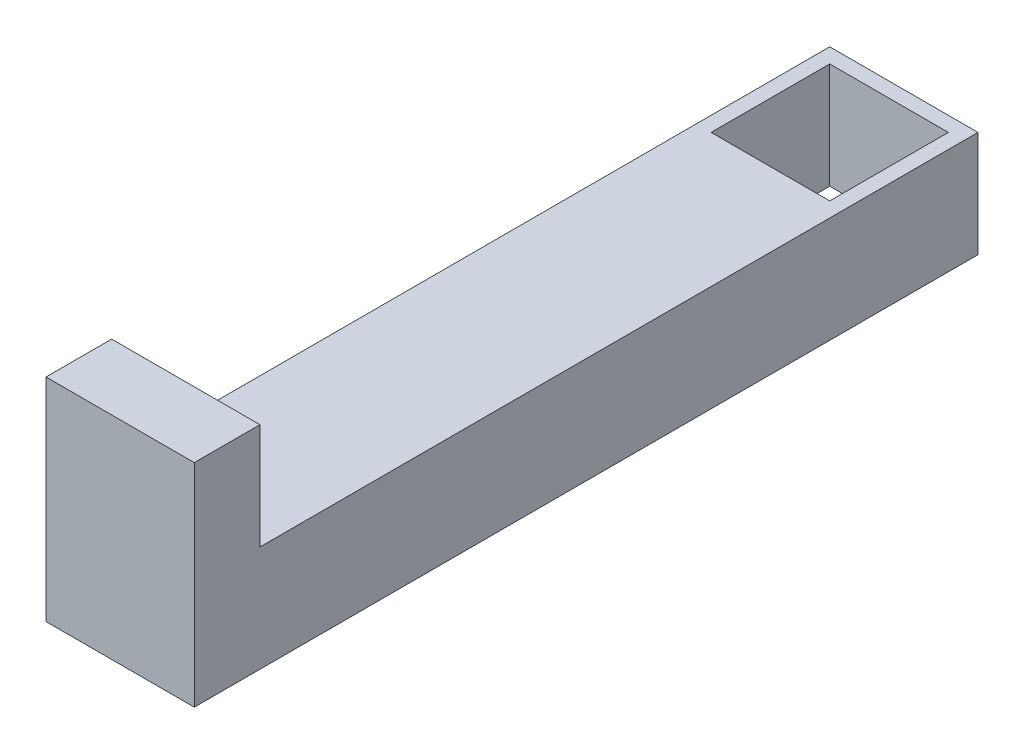
ISO-10303-21;
HEADER;
FILE_DESCRIPTION(('STEP AP214'),'2;1');
FILE_NAME('part.step','',(''),(''),'','','');
FILE_SCHEMA(('AUTOMOTIVE_DESIGN { 1 0 10303 214 1 1 1 1 }'));
ENDSEC;
DATA;
#1=APPLICATION_CONTEXT('core data for automotive mechanical design processes');
#2=APPLICATION_PROTOCOL_DEFINITION('international standard','automotive_design',2000,#1);
#3=PRODUCT_CONTEXT('',#1,'mechanical');
#4=PRODUCT('Part','Part','',(#3));
#5=PRODUCT_RELATED_PRODUCT_CATEGORY('part','',(#4));
#6=PRODUCT_DEFINITION_FORMATION('','',#4);
#7=PRODUCT_DEFINITION_CONTEXT('part definition',#1,'design');
#8=PRODUCT_DEFINITION('design','',#6,#7);
#9=PRODUCT_DEFINITION_SHAPE('','',#8);
#10=(LENGTH_UNIT() NAMED_UNIT(*) SI_UNIT(.MILLI.,.METRE.));
#11=(NAMED_UNIT(*) PLANE_ANGLE_UNIT() SI_UNIT($,.RADIAN.));
#12=(NAMED_UNIT(*) SI_UNIT($,.STERADIAN.) SOLID_ANGLE_UNIT());
#13=UNCERTAINTY_MEASURE_WITH_UNIT(LENGTH_MEASURE(1.E-05),#10,'distance_accuracy_value','');
#14=(GEOMETRIC_REPRESENTATION_CONTEXT(3) GLOBAL_UNCERTAINTY_ASSIGNED_CONTEXT((#13)) GLOBAL_UNIT_ASSIGNED_CONTEXT((#10,
#11,#12)) REPRESENTATION_CONTEXT('',''));
#15=CARTESIAN_POINT('',(0.,0.,0.));
#16=DIRECTION('',(0.,0.,1.));
#17=DIRECTION('',(1.,0.,0.));
#18=AXIS2_PLACEMENT_3D('',#15,#16,#17);
#19=CARTESIAN_POINT('',(0.,2.5,0.));
#20=DIRECTION('',(0.,1.,0.));
#21=DIRECTION('',(0.,0.,1.));
#22=AXIS2_PLACEMENT_3D('',#19,#20,#21);
#23=PLANE('',#22);
#24=DIRECTION('',(-1.,0.,0.));
#25=VECTOR('',#24,1.);
#26=CARTESIAN_POINT('',(-1.75,2.5,15.2002527735454));
#27=LINE('',#26,#25);
#28=CARTESIAN_POINT('',(1.75,2.5,15.2002527735454));
#29=VERTEX_POINT('',#28);
#30=CARTESIAN_POINT('',(-1.75,2.5,15.2002527735454));
#31=VERTEX_POINT('',#30);
#32=EDGE_CURVE('E51',#29,#31,#27,.T.);
#33=ORIENTED_EDGE('',*,*,#32,.F.);
#34=DIRECTION('',(0.,0.,-1.));
#35=VECTOR('',#34,1.);
#36=CARTESIAN_POINT('',(1.75,2.5,-1.75));
#37=LINE('',#36,#35);
#38=CARTESIAN_POINT('',(1.75,2.5,-1.75));
#39=VERTEX_POINT('',#38);
#40=EDGE_CURVE('E178',#29,#39,#37,.T.);
#41=ORIENTED_EDGE('',*,*,#40,.T.);
#42=DIRECTION('',(-1.,0.,0.));
#43=VECTOR('',#42,1.);
#44=CARTESIAN_POINT('',(-1.75,2.5,-1.75));
#45=LINE('',#44,#43);
#46=CARTESIAN_POINT('',(-1.75,2.5,-1.75));
#47=VERTEX_POINT('',#46);
#48=EDGE_CURVE('E180',#39,#47,#45,.T.);
#49=ORIENTED_EDGE('',*,*,#48,.T.);
#50=DIRECTION('',(0.,0.,1.));
#51=VECTOR('',#50,1.);
#52=CARTESIAN_POINT('',(-1.75,2.5,-1.75));
#53=LINE('',#52,#51);
#54=EDGE_CURVE('E183',#47,#31,#53,.T.);
#55=ORIENTED_EDGE('',*,*,#54,.T.);
#56=EDGE_LOOP('',(#33,#41,#49,#55));
#57=FACE_BOUND('',#56,.T.);
#58=DIRECTION('',(-1.,0.,0.));
#59=VECTOR('',#58,1.);
#60=CARTESIAN_POINT('',(-1.4,2.5,-1.4));
#61=LINE('',#60,#59);
#62=CARTESIAN_POINT('',(1.4,2.5,-1.4));
#63=VERTEX_POINT('',#62);
#64=CARTESIAN_POINT('',(-1.4,2.5,-1.4));
#65=VERTEX_POINT('',#64);
#66=EDGE_CURVE('E151',#63,#65,#61,.T.);
#67=ORIENTED_EDGE('',*,*,#66,.F.);
#68=DIRECTION('',(0.,0.,-1.));
#69=VECTOR('',#68,1.);
#70=CARTESIAN_POINT('',(1.4,2.5,1.4));
#71=LINE('',#70,#69);
#72=CARTESIAN_POINT('',(1.4,2.5,1.4));
#73=VERTEX_POINT('',#72);
#74=EDGE_CURVE('E149',#73,#63,#71,.T.);
#75=ORIENTED_EDGE('',*,*,#74,.F.);
#76=DIRECTION('',(1.,0.,0.));
#77=VECTOR('',#76,1.);
#78=CARTESIAN_POINT('',(-1.4,2.5,1.4));
#79=LINE('',#78,#77);
#80=CARTESIAN_POINT('',(-1.4,2.5,1.4));
#81=VERTEX_POINT('',#80);
#82=EDGE_CURVE('E156',#81,#73,#79,.T.);
#83=ORIENTED_EDGE('',*,*,#82,.F.);
#84=DIRECTION('',(0.,0.,1.));
#85=VECTOR('',#84,1.);
#86=CARTESIAN_POINT('',(-1.4,2.5,1.4));
#87=LINE('',#86,#85);
#88=EDGE_CURVE('E154',#65,#81,#87,.T.);
#89=ORIENTED_EDGE('',*,*,#88,.F.);
#90=EDGE_LOOP('',(#67,#75,#83,#89));
#91=FACE_BOUND('',#90,.T.);
#92=ADVANCED_FACE('F36',(#57,#91),#23,.T.);
#93=CARTESIAN_POINT('',(0.,0.,0.));
#94=DIRECTION('',(0.,1.,0.));
#95=DIRECTION('',(0.,0.,1.));
#96=AXIS2_PLACEMENT_3D('',#93,#94,#95);
#97=PLANE('',#96);
#98=DIRECTION('',(0.,0.,-1.));
#99=VECTOR('',#98,1.);
#100=CARTESIAN_POINT('',(1.75,0.,-1.75));
#101=LINE('',#100,#99);
#102=CARTESIAN_POINT('',(1.75,0.,16.75));
#103=VERTEX_POINT('',#102);
#104=CARTESIAN_POINT('',(1.75,0.,-1.75));
#105=VERTEX_POINT('',#104);
#106=EDGE_CURVE('E177',#103,#105,#101,.T.);
#107=ORIENTED_EDGE('',*,*,#106,.F.);
#108=DIRECTION('',(1.,0.,0.));
#109=VECTOR('',#108,1.);
#110=CARTESIAN_POINT('',(-1.75,0.,16.75));
#111=LINE('',#110,#109);
#112=CARTESIAN_POINT('',(-1.75,0.,16.75));
#113=VERTEX_POINT('',#112);
#114=EDGE_CURVE('E181',#113,#103,#111,.T.);
#115=ORIENTED_EDGE('',*,*,#114,.F.);
#116=DIRECTION('',(0.,0.,1.));
#117=VECTOR('',#116,1.);
#118=CARTESIAN_POINT('',(-1.75,0.,-1.75));
#119=LINE('',#118,#117);
#120=CARTESIAN_POINT('',(-1.75,0.,-1.75));
#121=VERTEX_POINT('',#120);
#122=EDGE_CURVE('E121',#121,#113,#119,.T.);
#123=ORIENTED_EDGE('',*,*,#122,.F.);
#124=DIRECTION('',(-1.,0.,0.));
#125=VECTOR('',#124,1.);
#126=CARTESIAN_POINT('',(-1.75,0.,-1.75));
#127=LINE('',#126,#125);
#128=EDGE_CURVE('E187',#105,#121,#127,.T.);
#129=ORIENTED_EDGE('',*,*,#128,.F.);
#130=EDGE_LOOP('',(#107,#115,#123,#129));
#131=FACE_BOUND('',#130,.T.);
#132=DIRECTION('',(0.,0.,-1.));
#133=VECTOR('',#132,1.);
#134=CARTESIAN_POINT('',(1.4,0.,1.4));
#135=LINE('',#134,#133);
#136=CARTESIAN_POINT('',(1.4,0.,1.4));
#137=VERTEX_POINT('',#136);
#138=CARTESIAN_POINT('',(1.4,0.,-1.4));
#139=VERTEX_POINT('',#138);
#140=EDGE_CURVE('E148',#137,#139,#135,.T.);
#141=ORIENTED_EDGE('',*,*,#140,.T.);
#142=DIRECTION('',(-1.,0.,0.));
#143=VECTOR('',#142,1.);
#144=CARTESIAN_POINT('',(-1.4,0.,-1.4));
#145=LINE('',#144,#143);
#146=CARTESIAN_POINT('',(-1.4,0.,-1.4));
#147=VERTEX_POINT('',#146);
#148=EDGE_CURVE('E161',#139,#147,#145,.T.);
#149=ORIENTED_EDGE('',*,*,#148,.T.);
#150=DIRECTION('',(0.,0.,1.));
#151=VECTOR('',#150,1.);
#152=CARTESIAN_POINT('',(-1.4,0.,1.4));
#153=LINE('',#152,#151);
#154=CARTESIAN_POINT('',(-1.4,0.,1.4));
#155=VERTEX_POINT('',#154);
#156=EDGE_CURVE('E164',#147,#155,#153,.T.);
#157=ORIENTED_EDGE('',*,*,#156,.T.);
#158=DIRECTION('',(1.,0.,0.));
#159=VECTOR('',#158,1.);
#160=CARTESIAN_POINT('',(-1.4,0.,1.4));
#161=LINE('',#160,#159);
#162=EDGE_CURVE('E152',#155,#137,#161,.T.);
#163=ORIENTED_EDGE('',*,*,#162,.T.);
#164=EDGE_LOOP('',(#141,#149,#157,#163));
#165=FACE_BOUND('',#164,.T.);
#166=ADVANCED_FACE('F197',(#131,#165),#97,.F.);
#167=CARTESIAN_POINT('',(1.75,2.5,-1.75));
#168=DIRECTION('',(-1.,0.,0.));
#169=DIRECTION('',(0.,0.,1.));
#170=AXIS2_PLACEMENT_3D('',#167,#168,#169);
#171=PLANE('',#170);
#172=ORIENTED_EDGE('',*,*,#106,.T.);
#173=DIRECTION('',(0.,-1.,0.));
#174=VECTOR('',#173,1.);
#175=CARTESIAN_POINT('',(1.75,2.5,-1.75));
#176=LINE('',#175,#174);
#177=EDGE_CURVE('E11',#39,#105,#176,.T.);
#178=ORIENTED_EDGE('',*,*,#177,.F.);
#179=ORIENTED_EDGE('',*,*,#40,.F.);
#180=DIRECTION('',(0.,-1.,0.));
#181=VECTOR('',#180,1.);
#182=CARTESIAN_POINT('',(1.75,5.,15.2002527735454));
#183=LINE('',#182,#181);
#184=CARTESIAN_POINT('',(1.75,5.,15.2002527735454));
#185=VERTEX_POINT('',#184);
#186=EDGE_CURVE('E145',#185,#29,#183,.T.);
#187=ORIENTED_EDGE('',*,*,#186,.F.);
#188=DIRECTION('',(0.,0.,-1.));
#189=VECTOR('',#188,1.);
#190=CARTESIAN_POINT('',(1.75,5.,16.75));
#191=LINE('',#190,#189);
#192=CARTESIAN_POINT('',(1.75,5.,16.75));
#193=VERTEX_POINT('',#192);
#194=EDGE_CURVE('E132',#193,#185,#191,.T.);
#195=ORIENTED_EDGE('',*,*,#194,.F.);
#196=DIRECTION('',(0.,-1.,0.));
#197=VECTOR('',#196,1.);
#198=CARTESIAN_POINT('',(1.75,2.5,16.75));
#199=LINE('',#198,#197);
#200=EDGE_CURVE('E124',#193,#103,#199,.T.);
#201=ORIENTED_EDGE('',*,*,#200,.T.);
#202=EDGE_LOOP('',(#172,#178,#179,#187,#195,#201));
#203=FACE_BOUND('',#202,.T.);
#204=ADVANCED_FACE('F38',(#203),#171,.F.);
#205=CARTESIAN_POINT('',(-1.75,2.5,-1.75));
#206=DIRECTION('',(0.,0.,1.));
#207=DIRECTION('',(1.,0.,0.));
#208=AXIS2_PLACEMENT_3D('',#205,#206,#207);
#209=PLANE('',#208);
#210=ORIENTED_EDGE('',*,*,#128,.T.);
#211=DIRECTION('',(0.,-1.,0.));
#212=VECTOR('',#211,1.);
#213=CARTESIAN_POINT('',(-1.75,2.5,-1.75));
#214=LINE('',#213,#212);
#215=EDGE_CURVE('E44',#47,#121,#214,.T.);
#216=ORIENTED_EDGE('',*,*,#215,.F.);
#217=ORIENTED_EDGE('',*,*,#48,.F.);
#218=ORIENTED_EDGE('',*,*,#177,.T.);
#219=EDGE_LOOP('',(#210,#216,#217,#218));
#220=FACE_BOUND('',#219,.T.);
#221=ADVANCED_FACE('F228',(#220),#209,.F.);
#222=CARTESIAN_POINT('',(-1.75,2.5,-1.75));
#223=DIRECTION('',(1.,0.,0.));
#224=DIRECTION('',(0.,0.,-1.));
#225=AXIS2_PLACEMENT_3D('',#222,#223,#224);
#226=PLANE('',#225);
#227=ORIENTED_EDGE('',*,*,#122,.T.);
#228=DIRECTION('',(0.,-1.,0.));
#229=VECTOR('',#228,1.);
#230=CARTESIAN_POINT('',(-1.75,2.5,16.75));
#231=LINE('',#230,#229);
#232=CARTESIAN_POINT('',(-1.75,5.,16.75));
#233=VERTEX_POINT('',#232);
#234=EDGE_CURVE('E113',#233,#113,#231,.T.);
#235=ORIENTED_EDGE('',*,*,#234,.F.);
#236=DIRECTION('',(0.,0.,1.));
#237=VECTOR('',#236,1.);
#238=CARTESIAN_POINT('',(-1.75,5.,16.75));
#239=LINE('',#238,#237);
#240=CARTESIAN_POINT('',(-1.75,5.,15.2002527735454));
#241=VERTEX_POINT('',#240);
#242=EDGE_CURVE('E118',#241,#233,#239,.T.);
#243=ORIENTED_EDGE('',*,*,#242,.F.);
#244=DIRECTION('',(0.,-1.,0.));
#245=VECTOR('',#244,1.);
#246=CARTESIAN_POINT('',(-1.75,5.,15.2002527735454));
#247=LINE('',#246,#245);
#248=EDGE_CURVE('E142',#241,#31,#247,.T.);
#249=ORIENTED_EDGE('',*,*,#248,.T.);
#250=ORIENTED_EDGE('',*,*,#54,.F.);
#251=ORIENTED_EDGE('',*,*,#215,.T.);
#252=EDGE_LOOP('',(#227,#235,#243,#249,#250,#251));
#253=FACE_BOUND('',#252,.T.);
#254=ADVANCED_FACE('F115',(#253),#226,.F.);
#255=CARTESIAN_POINT('',(-1.75,2.5,16.75));
#256=DIRECTION('',(0.,0.,-1.));
#257=DIRECTION('',(-1.,0.,0.));
#258=AXIS2_PLACEMENT_3D('',#255,#256,#257);
#259=PLANE('',#258);
#260=ORIENTED_EDGE('',*,*,#114,.T.);
#261=ORIENTED_EDGE('',*,*,#200,.F.);
#262=DIRECTION('',(1.,0.,0.));
#263=VECTOR('',#262,1.);
#264=CARTESIAN_POINT('',(-1.75,5.,16.75));
#265=LINE('',#264,#263);
#266=EDGE_CURVE('E127',#233,#193,#265,.T.);
#267=ORIENTED_EDGE('',*,*,#266,.F.);
#268=ORIENTED_EDGE('',*,*,#234,.T.);
#269=EDGE_LOOP('',(#260,#261,#267,#268));
#270=FACE_BOUND('',#269,.T.);
#271=ADVANCED_FACE('F128',(#270),#259,.F.);
#272=CARTESIAN_POINT('',(1.4,2.5,1.4));
#273=DIRECTION('',(-1.,0.,0.));
#274=DIRECTION('',(0.,0.,1.));
#275=AXIS2_PLACEMENT_3D('',#272,#273,#274);
#276=PLANE('',#275);
#277=ORIENTED_EDGE('',*,*,#140,.F.);
#278=DIRECTION('',(0.,-1.,0.));
#279=VECTOR('',#278,1.);
#280=CARTESIAN_POINT('',(1.4,2.5,1.4));
#281=LINE('',#280,#279);
#282=EDGE_CURVE('E158',#73,#137,#281,.T.);
#283=ORIENTED_EDGE('',*,*,#282,.F.);
#284=ORIENTED_EDGE('',*,*,#74,.T.);
#285=DIRECTION('',(0.,-1.,0.));
#286=VECTOR('',#285,1.);
#287=CARTESIAN_POINT('',(1.4,2.5,-1.4));
#288=LINE('',#287,#286);
#289=EDGE_CURVE('E174',#63,#139,#288,.T.);
#290=ORIENTED_EDGE('',*,*,#289,.T.);
#291=EDGE_LOOP('',(#277,#283,#284,#290));
#292=FACE_BOUND('',#291,.T.);
#293=ADVANCED_FACE('F222',(#292),#276,.T.);
#294=CARTESIAN_POINT('',(-1.4,2.5,-1.4));
#295=DIRECTION('',(0.,0.,1.));
#296=DIRECTION('',(1.,0.,0.));
#297=AXIS2_PLACEMENT_3D('',#294,#295,#296);
#298=PLANE('',#297);
#299=ORIENTED_EDGE('',*,*,#148,.F.);
#300=ORIENTED_EDGE('',*,*,#289,.F.);
#301=ORIENTED_EDGE('',*,*,#66,.T.);
#302=DIRECTION('',(0.,-1.,0.));
#303=VECTOR('',#302,1.);
#304=CARTESIAN_POINT('',(-1.4,2.5,-1.4));
#305=LINE('',#304,#303);
#306=EDGE_CURVE('E172',#65,#147,#305,.T.);
#307=ORIENTED_EDGE('',*,*,#306,.T.);
#308=EDGE_LOOP('',(#299,#300,#301,#307));
#309=FACE_BOUND('',#308,.T.);
#310=ADVANCED_FACE('F256',(#309),#298,.T.);
#311=CARTESIAN_POINT('',(-1.4,2.5,1.4));
#312=DIRECTION('',(1.,0.,0.));
#313=DIRECTION('',(0.,0.,-1.));
#314=AXIS2_PLACEMENT_3D('',#311,#312,#313);
#315=PLANE('',#314);
#316=ORIENTED_EDGE('',*,*,#156,.F.);
#317=ORIENTED_EDGE('',*,*,#306,.F.);
#318=ORIENTED_EDGE('',*,*,#88,.T.);
#319=DIRECTION('',(0.,-1.,0.));
#320=VECTOR('',#319,1.);
#321=CARTESIAN_POINT('',(-1.4,2.5,1.4));
#322=LINE('',#321,#320);
#323=EDGE_CURVE('E59',#81,#155,#322,.T.);
#324=ORIENTED_EDGE('',*,*,#323,.T.);
#325=EDGE_LOOP('',(#316,#317,#318,#324));
#326=FACE_BOUND('',#325,.T.);
#327=ADVANCED_FACE('F212',(#326),#315,.T.);
#328=CARTESIAN_POINT('',(-1.4,2.5,1.4));
#329=DIRECTION('',(0.,0.,-1.));
#330=DIRECTION('',(-1.,0.,0.));
#331=AXIS2_PLACEMENT_3D('',#328,#329,#330);
#332=PLANE('',#331);
#333=ORIENTED_EDGE('',*,*,#162,.F.);
#334=ORIENTED_EDGE('',*,*,#323,.F.);
#335=ORIENTED_EDGE('',*,*,#82,.T.);
#336=ORIENTED_EDGE('',*,*,#282,.T.);
#337=EDGE_LOOP('',(#333,#334,#335,#336));
#338=FACE_BOUND('',#337,.T.);
#339=ADVANCED_FACE('F205',(#338),#332,.T.);
#340=CARTESIAN_POINT('',(-1.75,5.,15.2002527735454));
#341=DIRECTION('',(0.,0.,1.));
#342=DIRECTION('',(1.,0.,0.));
#343=AXIS2_PLACEMENT_3D('',#340,#341,#342);
#344=PLANE('',#343);
#345=ORIENTED_EDGE('',*,*,#32,.T.);
#346=ORIENTED_EDGE('',*,*,#248,.F.);
#347=DIRECTION('',(-1.,0.,0.));
#348=VECTOR('',#347,1.);
#349=CARTESIAN_POINT('',(-1.75,5.,15.2002527735454));
#350=LINE('',#349,#348);
#351=EDGE_CURVE('E136',#185,#241,#350,.T.);
#352=ORIENTED_EDGE('',*,*,#351,.F.);
#353=ORIENTED_EDGE('',*,*,#186,.T.);
#354=EDGE_LOOP('',(#345,#346,#352,#353));
#355=FACE_BOUND('',#354,.T.);
#356=ADVANCED_FACE('F203',(#355),#344,.F.);
#357=CARTESIAN_POINT('',(0.,5.,0.));
#358=DIRECTION('',(0.,-1.,0.));
#359=DIRECTION('',(0.,0.,-1.));
#360=AXIS2_PLACEMENT_3D('',#357,#358,#359);
#361=PLANE('',#360);
#362=ORIENTED_EDGE('',*,*,#242,.T.);
#363=ORIENTED_EDGE('',*,*,#266,.T.);
#364=ORIENTED_EDGE('',*,*,#194,.T.);
#365=ORIENTED_EDGE('',*,*,#351,.T.);
#366=EDGE_LOOP('',(#362,#363,#364,#365));
#367=FACE_BOUND('',#366,.T.);
#368=ADVANCED_FACE('F134',(#367),#361,.F.);
#369=CLOSED_SHELL('',(#92,#166,#204,#221,#254,#271,#293,#310,#327,#339,#356,#368));
#370=MANIFOLD_SOLID_BREP('B2',#369);
#371=ADVANCED_BREP_SHAPE_REPRESENTATION('',(#18,#370),#14);
#372=SHAPE_DEFINITION_REPRESENTATION(#9,#371);
ENDSEC;
END-ISO-10303-21;
